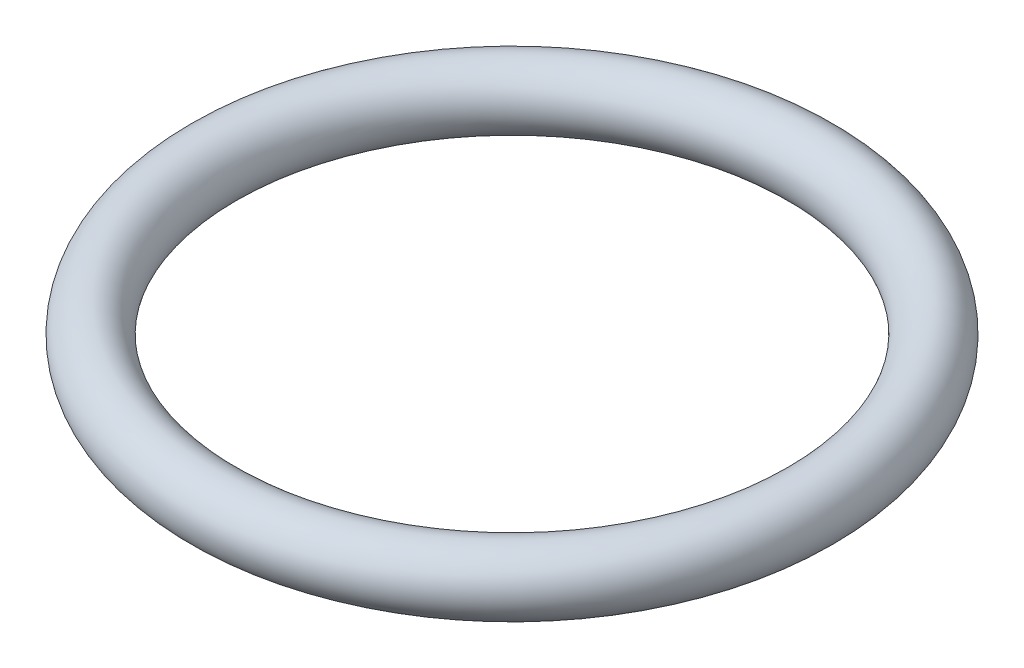
ISO-10303-21;
HEADER;
FILE_DESCRIPTION(('STEP AP214'),'2;1');
FILE_NAME('part.step','',(''),(''),'','','');
FILE_SCHEMA(('AUTOMOTIVE_DESIGN { 1 0 10303 214 1 1 1 1 }'));
ENDSEC;
DATA;
#1=APPLICATION_CONTEXT('core data for automotive mechanical design processes');
#2=APPLICATION_PROTOCOL_DEFINITION('international standard','automotive_design',2000,#1);
#3=PRODUCT_CONTEXT('',#1,'mechanical');
#4=PRODUCT('Part','Part','',(#3));
#5=PRODUCT_RELATED_PRODUCT_CATEGORY('part','',(#4));
#6=PRODUCT_DEFINITION_FORMATION('','',#4);
#7=PRODUCT_DEFINITION_CONTEXT('part definition',#1,'design');
#8=PRODUCT_DEFINITION('design','',#6,#7);
#9=PRODUCT_DEFINITION_SHAPE('','',#8);
#10=(LENGTH_UNIT() NAMED_UNIT(*) SI_UNIT(.MILLI.,.METRE.));
#11=(NAMED_UNIT(*) PLANE_ANGLE_UNIT() SI_UNIT($,.RADIAN.));
#12=(NAMED_UNIT(*) SI_UNIT($,.STERADIAN.) SOLID_ANGLE_UNIT());
#13=UNCERTAINTY_MEASURE_WITH_UNIT(LENGTH_MEASURE(1.E-05),#10,'distance_accuracy_value','');
#14=(GEOMETRIC_REPRESENTATION_CONTEXT(3) GLOBAL_UNCERTAINTY_ASSIGNED_CONTEXT((#13)) GLOBAL_UNIT_ASSIGNED_CONTEXT((#10,
#11,#12)) REPRESENTATION_CONTEXT('',''));
#15=CARTESIAN_POINT('',(0.,0.,0.));
#16=DIRECTION('',(0.,0.,1.));
#17=DIRECTION('',(1.,0.,0.));
#18=AXIS2_PLACEMENT_3D('',#15,#16,#17);
#19=CARTESIAN_POINT('',(0.,0.,0.));
#20=DIRECTION('',(0.,1.,0.));
#21=DIRECTION('',(-1.,0.,0.));
#22=AXIS2_PLACEMENT_3D('',#19,#20,#21);
#23=TOROIDAL_SURFACE('',#22,27.4,2.9);
#24=CARTESIAN_POINT('',(-30.3,0.,0.));
#25=VERTEX_POINT('',#24);
#26=VERTEX_LOOP('',#25);
#27=FACE_BOUND('',#26,.T.);
#28=ADVANCED_FACE('F91',(#27),#23,.T.);
#29=CLOSED_SHELL('',(#28));
#30=MANIFOLD_SOLID_BREP('B39',#29);
#31=ADVANCED_BREP_SHAPE_REPRESENTATION('',(#18,#30),#14);
#32=SHAPE_DEFINITION_REPRESENTATION(#9,#31);
ENDSEC;
END-ISO-10303-21;
